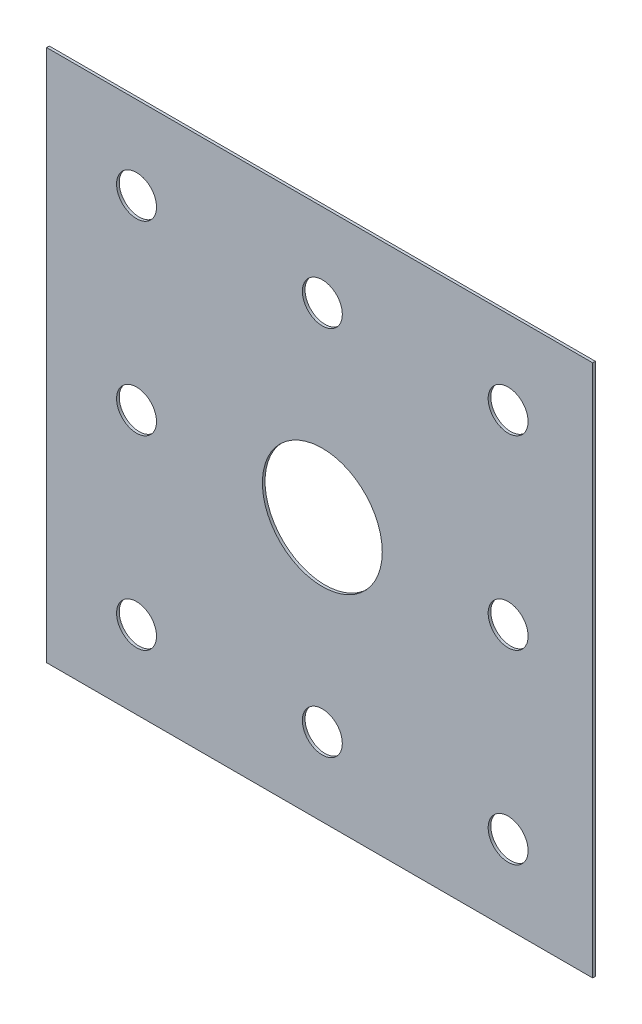
ISO-10303-21;
HEADER;
FILE_DESCRIPTION(('STEP AP214'),'2;1');
FILE_NAME('part.step','',(''),(''),'','','');
FILE_SCHEMA(('AUTOMOTIVE_DESIGN { 1 0 10303 214 1 1 1 1 }'));
ENDSEC;
DATA;
#1=APPLICATION_CONTEXT('core data for automotive mechanical design processes');
#2=APPLICATION_PROTOCOL_DEFINITION('international standard','automotive_design',2000,#1);
#3=PRODUCT_CONTEXT('',#1,'mechanical');
#4=PRODUCT('Part','Part','',(#3));
#5=PRODUCT_RELATED_PRODUCT_CATEGORY('part','',(#4));
#6=PRODUCT_DEFINITION_FORMATION('','',#4);
#7=PRODUCT_DEFINITION_CONTEXT('part definition',#1,'design');
#8=PRODUCT_DEFINITION('design','',#6,#7);
#9=PRODUCT_DEFINITION_SHAPE('','',#8);
#10=(LENGTH_UNIT() NAMED_UNIT(*) SI_UNIT(.MILLI.,.METRE.));
#11=(NAMED_UNIT(*) PLANE_ANGLE_UNIT() SI_UNIT($,.RADIAN.));
#12=(NAMED_UNIT(*) SI_UNIT($,.STERADIAN.) SOLID_ANGLE_UNIT());
#13=UNCERTAINTY_MEASURE_WITH_UNIT(LENGTH_MEASURE(1.E-05),#10,'distance_accuracy_value','');
#14=(GEOMETRIC_REPRESENTATION_CONTEXT(3) GLOBAL_UNCERTAINTY_ASSIGNED_CONTEXT((#13)) GLOBAL_UNIT_ASSIGNED_CONTEXT((#10,
#11,#12)) REPRESENTATION_CONTEXT('',''));
#15=CARTESIAN_POINT('',(0.,0.,0.));
#16=DIRECTION('',(0.,0.,1.));
#17=DIRECTION('',(1.,0.,0.));
#18=AXIS2_PLACEMENT_3D('',#15,#16,#17);
#19=CARTESIAN_POINT('',(0.,40.,0.2));
#20=DIRECTION('',(1.,0.,0.));
#21=DIRECTION('',(0.,0.,-1.));
#22=AXIS2_PLACEMENT_3D('',#19,#20,#21);
#23=PLANE('',#22);
#24=DIRECTION('',(0.,-1.,0.));
#25=VECTOR('',#24,1.);
#26=CARTESIAN_POINT('',(0.,40.,0.));
#27=LINE('',#26,#25);
#28=CARTESIAN_POINT('',(0.,40.,0.));
#29=VERTEX_POINT('',#28);
#30=CARTESIAN_POINT('',(0.,0.,0.));
#31=VERTEX_POINT('',#30);
#32=EDGE_CURVE('E98',#29,#31,#27,.T.);
#33=ORIENTED_EDGE('',*,*,#32,.T.);
#34=DIRECTION('',(0.,0.,-1.));
#35=VECTOR('',#34,1.);
#36=CARTESIAN_POINT('',(0.,0.,0.2));
#37=LINE('',#36,#35);
#38=CARTESIAN_POINT('',(0.,0.,0.2));
#39=VERTEX_POINT('',#38);
#40=EDGE_CURVE('E11',#39,#31,#37,.T.);
#41=ORIENTED_EDGE('',*,*,#40,.F.);
#42=DIRECTION('',(0.,-1.,0.));
#43=VECTOR('',#42,1.);
#44=CARTESIAN_POINT('',(0.,40.,0.2));
#45=LINE('',#44,#43);
#46=CARTESIAN_POINT('',(0.,40.,0.2));
#47=VERTEX_POINT('',#46);
#48=EDGE_CURVE('E86',#47,#39,#45,.T.);
#49=ORIENTED_EDGE('',*,*,#48,.F.);
#50=DIRECTION('',(0.,0.,-1.));
#51=VECTOR('',#50,1.);
#52=CARTESIAN_POINT('',(0.,40.,0.2));
#53=LINE('',#52,#51);
#54=EDGE_CURVE('E94',#47,#29,#53,.T.);
#55=ORIENTED_EDGE('',*,*,#54,.T.);
#56=EDGE_LOOP('',(#33,#41,#49,#55));
#57=FACE_BOUND('',#56,.T.);
#58=ADVANCED_FACE('F35',(#57),#23,.F.);
#59=CARTESIAN_POINT('',(0.,0.,0.2));
#60=DIRECTION('',(0.,1.,0.));
#61=DIRECTION('',(0.,0.,1.));
#62=AXIS2_PLACEMENT_3D('',#59,#60,#61);
#63=PLANE('',#62);
#64=DIRECTION('',(1.,0.,0.));
#65=VECTOR('',#64,1.);
#66=CARTESIAN_POINT('',(0.,0.,0.));
#67=LINE('',#66,#65);
#68=CARTESIAN_POINT('',(41.,0.,0.));
#69=VERTEX_POINT('',#68);
#70=EDGE_CURVE('E90',#31,#69,#67,.T.);
#71=ORIENTED_EDGE('',*,*,#70,.T.);
#72=DIRECTION('',(0.,0.,-1.));
#73=VECTOR('',#72,1.);
#74=CARTESIAN_POINT('',(41.,0.,0.2));
#75=LINE('',#74,#73);
#76=CARTESIAN_POINT('',(41.,0.,0.2));
#77=VERTEX_POINT('',#76);
#78=EDGE_CURVE('E43',#77,#69,#75,.T.);
#79=ORIENTED_EDGE('',*,*,#78,.F.);
#80=DIRECTION('',(1.,0.,0.));
#81=VECTOR('',#80,1.);
#82=CARTESIAN_POINT('',(0.,0.,0.2));
#83=LINE('',#82,#81);
#84=EDGE_CURVE('E81',#39,#77,#83,.T.);
#85=ORIENTED_EDGE('',*,*,#84,.F.);
#86=ORIENTED_EDGE('',*,*,#40,.T.);
#87=EDGE_LOOP('',(#71,#79,#85,#86));
#88=FACE_BOUND('',#87,.T.);
#89=ADVANCED_FACE('F89',(#88),#63,.F.);
#90=CARTESIAN_POINT('',(41.,40.,0.2));
#91=DIRECTION('',(-1.,0.,0.));
#92=DIRECTION('',(0.,0.,1.));
#93=AXIS2_PLACEMENT_3D('',#90,#91,#92);
#94=PLANE('',#93);
#95=DIRECTION('',(0.,1.,0.));
#96=VECTOR('',#95,1.);
#97=CARTESIAN_POINT('',(41.,40.,0.));
#98=LINE('',#97,#96);
#99=CARTESIAN_POINT('',(41.,40.,0.));
#100=VERTEX_POINT('',#99);
#101=EDGE_CURVE('E68',#69,#100,#98,.T.);
#102=ORIENTED_EDGE('',*,*,#101,.T.);
#103=DIRECTION('',(0.,0.,-1.));
#104=VECTOR('',#103,1.);
#105=CARTESIAN_POINT('',(41.,40.,0.2));
#106=LINE('',#105,#104);
#107=CARTESIAN_POINT('',(41.,40.,0.2));
#108=VERTEX_POINT('',#107);
#109=EDGE_CURVE('E91',#108,#100,#106,.T.);
#110=ORIENTED_EDGE('',*,*,#109,.F.);
#111=DIRECTION('',(0.,1.,0.));
#112=VECTOR('',#111,1.);
#113=CARTESIAN_POINT('',(41.,40.,0.2));
#114=LINE('',#113,#112);
#115=EDGE_CURVE('E84',#77,#108,#114,.T.);
#116=ORIENTED_EDGE('',*,*,#115,.F.);
#117=ORIENTED_EDGE('',*,*,#78,.T.);
#118=EDGE_LOOP('',(#102,#110,#116,#117));
#119=FACE_BOUND('',#118,.T.);
#120=ADVANCED_FACE('F92',(#119),#94,.F.);
#121=CARTESIAN_POINT('',(0.,40.,0.2));
#122=DIRECTION('',(0.,-1.,0.));
#123=DIRECTION('',(0.,0.,-1.));
#124=AXIS2_PLACEMENT_3D('',#121,#122,#123);
#125=PLANE('',#124);
#126=DIRECTION('',(-1.,0.,0.));
#127=VECTOR('',#126,1.);
#128=CARTESIAN_POINT('',(0.,40.,0.));
#129=LINE('',#128,#127);
#130=EDGE_CURVE('E74',#100,#29,#129,.T.);
#131=ORIENTED_EDGE('',*,*,#130,.T.);
#132=ORIENTED_EDGE('',*,*,#54,.F.);
#133=DIRECTION('',(-1.,0.,0.));
#134=VECTOR('',#133,1.);
#135=CARTESIAN_POINT('',(0.,40.,0.2));
#136=LINE('',#135,#134);
#137=EDGE_CURVE('E51',#108,#47,#136,.T.);
#138=ORIENTED_EDGE('',*,*,#137,.F.);
#139=ORIENTED_EDGE('',*,*,#109,.T.);
#140=EDGE_LOOP('',(#131,#132,#138,#139));
#141=FACE_BOUND('',#140,.T.);
#142=ADVANCED_FACE('F106',(#141),#125,.F.);
#143=CARTESIAN_POINT('',(0.,0.,0.2));
#144=DIRECTION('',(0.,0.,1.));
#145=DIRECTION('',(1.,0.,0.));
#146=AXIS2_PLACEMENT_3D('',#143,#144,#145);
#147=PLANE('',#146);
#148=CARTESIAN_POINT('',(6.74999999999955,5.8499999999996,0.2));
#149=DIRECTION('',(0.,0.,1.));
#150=DIRECTION('',(1.,0.,0.));
#151=AXIS2_PLACEMENT_3D('',#148,#149,#150);
#152=CIRCLE('',#151,1.49999999999996);
#153=CARTESIAN_POINT('',(8.2499999999995,5.8499999999996,0.2));
#154=VERTEX_POINT('',#153);
#155=EDGE_CURVE('E134',#154,#154,#152,.T.);
#156=ORIENTED_EDGE('',*,*,#155,.F.);
#157=EDGE_LOOP('',(#156));
#158=FACE_BOUND('',#157,.T.);
#159=CARTESIAN_POINT('',(6.74999999999954,33.7499999999998,0.2));
#160=DIRECTION('',(0.,0.,1.));
#161=DIRECTION('',(1.,0.,0.));
#162=AXIS2_PLACEMENT_3D('',#159,#160,#161);
#163=CIRCLE('',#162,1.50000000000028);
#164=CARTESIAN_POINT('',(8.24999999999982,33.7499999999998,0.2));
#165=VERTEX_POINT('',#164);
#166=EDGE_CURVE('E127',#165,#165,#163,.T.);
#167=ORIENTED_EDGE('',*,*,#166,.F.);
#168=EDGE_LOOP('',(#167));
#169=FACE_BOUND('',#168,.T.);
#170=CARTESIAN_POINT('',(6.75,19.8000000000001,0.2));
#171=DIRECTION('',(0.,0.,1.));
#172=DIRECTION('',(1.,0.,0.));
#173=AXIS2_PLACEMENT_3D('',#170,#171,#172);
#174=CIRCLE('',#173,1.5);
#175=CARTESIAN_POINT('',(8.25,19.8000000000001,0.2));
#176=VERTEX_POINT('',#175);
#177=EDGE_CURVE('E128',#176,#176,#174,.T.);
#178=ORIENTED_EDGE('',*,*,#177,.F.);
#179=EDGE_LOOP('',(#178));
#180=FACE_BOUND('',#179,.T.);
#181=CARTESIAN_POINT('',(34.6499999999997,5.8499999999996,0.2));
#182=DIRECTION('',(0.,0.,1.));
#183=DIRECTION('',(1.,0.,0.));
#184=AXIS2_PLACEMENT_3D('',#181,#182,#183);
#185=CIRCLE('',#184,1.49999999999923);
#186=CARTESIAN_POINT('',(36.1499999999989,5.8499999999996,0.2));
#187=VERTEX_POINT('',#186);
#188=EDGE_CURVE('E145',#187,#187,#185,.T.);
#189=ORIENTED_EDGE('',*,*,#188,.F.);
#190=EDGE_LOOP('',(#189));
#191=FACE_BOUND('',#190,.T.);
#192=CARTESIAN_POINT('',(20.6999999999999,5.85000000000001,0.2));
#193=DIRECTION('',(0.,0.,1.));
#194=DIRECTION('',(1.,0.,0.));
#195=AXIS2_PLACEMENT_3D('',#192,#193,#194);
#196=CIRCLE('',#195,1.5);
#197=CARTESIAN_POINT('',(22.2,5.85000000000001,0.2));
#198=VERTEX_POINT('',#197);
#199=EDGE_CURVE('E151',#198,#198,#196,.T.);
#200=ORIENTED_EDGE('',*,*,#199,.F.);
#201=EDGE_LOOP('',(#200));
#202=FACE_BOUND('',#201,.T.);
#203=CARTESIAN_POINT('',(34.65,19.8,0.2));
#204=DIRECTION('',(0.,0.,1.));
#205=DIRECTION('',(1.,0.,0.));
#206=AXIS2_PLACEMENT_3D('',#203,#204,#205);
#207=CIRCLE('',#206,1.5);
#208=CARTESIAN_POINT('',(36.15,19.8,0.2));
#209=VERTEX_POINT('',#208);
#210=EDGE_CURVE('E157',#209,#209,#207,.T.);
#211=ORIENTED_EDGE('',*,*,#210,.F.);
#212=EDGE_LOOP('',(#211));
#213=FACE_BOUND('',#212,.T.);
#214=CARTESIAN_POINT('',(34.6499999999997,33.7499999999998,0.2));
#215=DIRECTION('',(0.,0.,1.));
#216=DIRECTION('',(1.,0.,0.));
#217=AXIS2_PLACEMENT_3D('',#214,#215,#216);
#218=CIRCLE('',#217,1.49999999999967);
#219=CARTESIAN_POINT('',(36.1499999999994,33.7499999999998,0.2));
#220=VERTEX_POINT('',#219);
#221=EDGE_CURVE('E121',#220,#220,#218,.T.);
#222=ORIENTED_EDGE('',*,*,#221,.F.);
#223=EDGE_LOOP('',(#222));
#224=FACE_BOUND('',#223,.T.);
#225=CARTESIAN_POINT('',(20.7000000000002,33.75,0.2));
#226=DIRECTION('',(0.,0.,1.));
#227=DIRECTION('',(1.,0.,0.));
#228=AXIS2_PLACEMENT_3D('',#225,#226,#227);
#229=CIRCLE('',#228,1.50000000000001);
#230=CARTESIAN_POINT('',(22.2000000000002,33.75,0.2));
#231=VERTEX_POINT('',#230);
#232=EDGE_CURVE('E118',#231,#231,#229,.T.);
#233=ORIENTED_EDGE('',*,*,#232,.F.);
#234=EDGE_LOOP('',(#233));
#235=FACE_BOUND('',#234,.T.);
#236=CARTESIAN_POINT('',(20.7,19.8,0.2));
#237=DIRECTION('',(0.,0.,1.));
#238=DIRECTION('',(1.,0.,0.));
#239=AXIS2_PLACEMENT_3D('',#236,#237,#238);
#240=CIRCLE('',#239,4.5);
#241=CARTESIAN_POINT('',(25.2,19.8,0.2));
#242=VERTEX_POINT('',#241);
#243=EDGE_CURVE('E112',#242,#242,#240,.T.);
#244=ORIENTED_EDGE('',*,*,#243,.F.);
#245=EDGE_LOOP('',(#244));
#246=FACE_BOUND('',#245,.T.);
#247=ORIENTED_EDGE('',*,*,#48,.T.);
#248=ORIENTED_EDGE('',*,*,#84,.T.);
#249=ORIENTED_EDGE('',*,*,#115,.T.);
#250=ORIENTED_EDGE('',*,*,#137,.T.);
#251=EDGE_LOOP('',(#247,#248,#249,#250));
#252=FACE_BOUND('',#251,.T.);
#253=ADVANCED_FACE('F82',(#158,#169,#180,#191,#202,#213,#224,#235,#246,#252),#147,.T.);
#254=CARTESIAN_POINT('',(0.,0.,0.));
#255=DIRECTION('',(0.,0.,1.));
#256=DIRECTION('',(1.,0.,0.));
#257=AXIS2_PLACEMENT_3D('',#254,#255,#256);
#258=PLANE('',#257);
#259=CARTESIAN_POINT('',(6.74999999999955,5.8499999999996,0.));
#260=DIRECTION('',(0.,0.,1.));
#261=DIRECTION('',(1.,0.,0.));
#262=AXIS2_PLACEMENT_3D('',#259,#260,#261);
#263=CIRCLE('',#262,1.49999999999996);
#264=CARTESIAN_POINT('',(8.2499999999995,5.8499999999996,0.));
#265=VERTEX_POINT('',#264);
#266=EDGE_CURVE('E131',#265,#265,#263,.T.);
#267=ORIENTED_EDGE('',*,*,#266,.T.);
#268=EDGE_LOOP('',(#267));
#269=FACE_BOUND('',#268,.T.);
#270=CARTESIAN_POINT('',(6.74999999999954,33.7499999999998,0.));
#271=DIRECTION('',(0.,0.,1.));
#272=DIRECTION('',(1.,0.,0.));
#273=AXIS2_PLACEMENT_3D('',#270,#271,#272);
#274=CIRCLE('',#273,1.50000000000028);
#275=CARTESIAN_POINT('',(8.24999999999982,33.7499999999998,0.));
#276=VERTEX_POINT('',#275);
#277=EDGE_CURVE('E124',#276,#276,#274,.T.);
#278=ORIENTED_EDGE('',*,*,#277,.T.);
#279=EDGE_LOOP('',(#278));
#280=FACE_BOUND('',#279,.T.);
#281=CARTESIAN_POINT('',(6.75,19.8000000000001,0.));
#282=DIRECTION('',(0.,0.,1.));
#283=DIRECTION('',(1.,0.,0.));
#284=AXIS2_PLACEMENT_3D('',#281,#282,#283);
#285=CIRCLE('',#284,1.5);
#286=CARTESIAN_POINT('',(8.25,19.8000000000001,0.));
#287=VERTEX_POINT('',#286);
#288=EDGE_CURVE('E138',#287,#287,#285,.T.);
#289=ORIENTED_EDGE('',*,*,#288,.T.);
#290=EDGE_LOOP('',(#289));
#291=FACE_BOUND('',#290,.T.);
#292=CARTESIAN_POINT('',(34.6499999999997,5.8499999999996,0.));
#293=DIRECTION('',(0.,0.,1.));
#294=DIRECTION('',(1.,0.,0.));
#295=AXIS2_PLACEMENT_3D('',#292,#293,#294);
#296=CIRCLE('',#295,1.49999999999923);
#297=CARTESIAN_POINT('',(36.1499999999989,5.8499999999996,0.));
#298=VERTEX_POINT('',#297);
#299=EDGE_CURVE('E137',#298,#298,#296,.T.);
#300=ORIENTED_EDGE('',*,*,#299,.T.);
#301=EDGE_LOOP('',(#300));
#302=FACE_BOUND('',#301,.T.);
#303=CARTESIAN_POINT('',(20.6999999999999,5.85000000000001,0.));
#304=DIRECTION('',(0.,0.,1.));
#305=DIRECTION('',(1.,0.,0.));
#306=AXIS2_PLACEMENT_3D('',#303,#304,#305);
#307=CIRCLE('',#306,1.5);
#308=CARTESIAN_POINT('',(22.2,5.85000000000001,0.));
#309=VERTEX_POINT('',#308);
#310=EDGE_CURVE('E148',#309,#309,#307,.T.);
#311=ORIENTED_EDGE('',*,*,#310,.T.);
#312=EDGE_LOOP('',(#311));
#313=FACE_BOUND('',#312,.T.);
#314=CARTESIAN_POINT('',(34.65,19.8,0.));
#315=DIRECTION('',(0.,0.,1.));
#316=DIRECTION('',(1.,0.,0.));
#317=AXIS2_PLACEMENT_3D('',#314,#315,#316);
#318=CIRCLE('',#317,1.5);
#319=CARTESIAN_POINT('',(36.15,19.8,0.));
#320=VERTEX_POINT('',#319);
#321=EDGE_CURVE('E154',#320,#320,#318,.T.);
#322=ORIENTED_EDGE('',*,*,#321,.T.);
#323=EDGE_LOOP('',(#322));
#324=FACE_BOUND('',#323,.T.);
#325=CARTESIAN_POINT('',(34.6499999999997,33.7499999999998,0.));
#326=DIRECTION('',(0.,0.,1.));
#327=DIRECTION('',(1.,0.,0.));
#328=AXIS2_PLACEMENT_3D('',#325,#326,#327);
#329=CIRCLE('',#328,1.49999999999967);
#330=CARTESIAN_POINT('',(36.1499999999994,33.7499999999998,0.));
#331=VERTEX_POINT('',#330);
#332=EDGE_CURVE('E160',#331,#331,#329,.T.);
#333=ORIENTED_EDGE('',*,*,#332,.T.);
#334=EDGE_LOOP('',(#333));
#335=FACE_BOUND('',#334,.T.);
#336=CARTESIAN_POINT('',(20.7000000000002,33.75,0.));
#337=DIRECTION('',(0.,0.,1.));
#338=DIRECTION('',(1.,0.,0.));
#339=AXIS2_PLACEMENT_3D('',#336,#337,#338);
#340=CIRCLE('',#339,1.50000000000001);
#341=CARTESIAN_POINT('',(22.2000000000002,33.75,0.));
#342=VERTEX_POINT('',#341);
#343=EDGE_CURVE('E115',#342,#342,#340,.T.);
#344=ORIENTED_EDGE('',*,*,#343,.T.);
#345=EDGE_LOOP('',(#344));
#346=FACE_BOUND('',#345,.T.);
#347=CARTESIAN_POINT('',(20.7,19.8,0.));
#348=DIRECTION('',(0.,0.,1.));
#349=DIRECTION('',(1.,0.,0.));
#350=AXIS2_PLACEMENT_3D('',#347,#348,#349);
#351=CIRCLE('',#350,4.5);
#352=CARTESIAN_POINT('',(25.2,19.8,0.));
#353=VERTEX_POINT('',#352);
#354=EDGE_CURVE('E101',#353,#353,#351,.T.);
#355=ORIENTED_EDGE('',*,*,#354,.T.);
#356=EDGE_LOOP('',(#355));
#357=FACE_BOUND('',#356,.T.);
#358=ORIENTED_EDGE('',*,*,#32,.F.);
#359=ORIENTED_EDGE('',*,*,#130,.F.);
#360=ORIENTED_EDGE('',*,*,#101,.F.);
#361=ORIENTED_EDGE('',*,*,#70,.F.);
#362=EDGE_LOOP('',(#358,#359,#360,#361));
#363=FACE_BOUND('',#362,.T.);
#364=ADVANCED_FACE('F109',(#269,#280,#291,#302,#313,#324,#335,#346,#357,#363),#258,.F.);
#365=CARTESIAN_POINT('',(20.7,19.8,0.));
#366=DIRECTION('',(0.,0.,1.));
#367=DIRECTION('',(1.,0.,0.));
#368=AXIS2_PLACEMENT_3D('',#365,#366,#367);
#369=CYLINDRICAL_SURFACE('',#368,4.5);
#370=ORIENTED_EDGE('',*,*,#354,.F.);
#371=EDGE_LOOP('',(#370));
#372=FACE_BOUND('',#371,.T.);
#373=ORIENTED_EDGE('',*,*,#243,.T.);
#374=EDGE_LOOP('',(#373));
#375=FACE_BOUND('',#374,.T.);
#376=ADVANCED_FACE('F176',(#372,#375),#369,.F.);
#377=CARTESIAN_POINT('',(20.7000000000002,33.75,0.));
#378=DIRECTION('',(0.,0.,1.));
#379=DIRECTION('',(1.,0.,0.));
#380=AXIS2_PLACEMENT_3D('',#377,#378,#379);
#381=CYLINDRICAL_SURFACE('',#380,1.50000000000001);
#382=ORIENTED_EDGE('',*,*,#343,.F.);
#383=EDGE_LOOP('',(#382));
#384=FACE_BOUND('',#383,.T.);
#385=ORIENTED_EDGE('',*,*,#232,.T.);
#386=EDGE_LOOP('',(#385));
#387=FACE_BOUND('',#386,.T.);
#388=ADVANCED_FACE('F178',(#384,#387),#381,.F.);
#389=CARTESIAN_POINT('',(34.6499999999997,33.7499999999998,0.));
#390=DIRECTION('',(0.,0.,1.));
#391=DIRECTION('',(1.,0.,0.));
#392=AXIS2_PLACEMENT_3D('',#389,#390,#391);
#393=CYLINDRICAL_SURFACE('',#392,1.49999999999967);
#394=ORIENTED_EDGE('',*,*,#332,.F.);
#395=EDGE_LOOP('',(#394));
#396=FACE_BOUND('',#395,.T.);
#397=ORIENTED_EDGE('',*,*,#221,.T.);
#398=EDGE_LOOP('',(#397));
#399=FACE_BOUND('',#398,.T.);
#400=ADVANCED_FACE('F166',(#396,#399),#393,.F.);
#401=CARTESIAN_POINT('',(34.65,19.8,0.));
#402=DIRECTION('',(0.,0.,1.));
#403=DIRECTION('',(1.,0.,0.));
#404=AXIS2_PLACEMENT_3D('',#401,#402,#403);
#405=CYLINDRICAL_SURFACE('',#404,1.5);
#406=ORIENTED_EDGE('',*,*,#321,.F.);
#407=EDGE_LOOP('',(#406));
#408=FACE_BOUND('',#407,.T.);
#409=ORIENTED_EDGE('',*,*,#210,.T.);
#410=EDGE_LOOP('',(#409));
#411=FACE_BOUND('',#410,.T.);
#412=ADVANCED_FACE('F228',(#408,#411),#405,.F.);
#413=CARTESIAN_POINT('',(20.6999999999999,5.85000000000001,0.));
#414=DIRECTION('',(0.,0.,1.));
#415=DIRECTION('',(1.,0.,0.));
#416=AXIS2_PLACEMENT_3D('',#413,#414,#415);
#417=CYLINDRICAL_SURFACE('',#416,1.5);
#418=ORIENTED_EDGE('',*,*,#310,.F.);
#419=EDGE_LOOP('',(#418));
#420=FACE_BOUND('',#419,.T.);
#421=ORIENTED_EDGE('',*,*,#199,.T.);
#422=EDGE_LOOP('',(#421));
#423=FACE_BOUND('',#422,.T.);
#424=ADVANCED_FACE('F238',(#420,#423),#417,.F.);
#425=CARTESIAN_POINT('',(34.6499999999997,5.8499999999996,0.));
#426=DIRECTION('',(0.,0.,1.));
#427=DIRECTION('',(1.,0.,0.));
#428=AXIS2_PLACEMENT_3D('',#425,#426,#427);
#429=CYLINDRICAL_SURFACE('',#428,1.49999999999923);
#430=ORIENTED_EDGE('',*,*,#299,.F.);
#431=EDGE_LOOP('',(#430));
#432=FACE_BOUND('',#431,.T.);
#433=ORIENTED_EDGE('',*,*,#188,.T.);
#434=EDGE_LOOP('',(#433));
#435=FACE_BOUND('',#434,.T.);
#436=ADVANCED_FACE('F248',(#432,#435),#429,.F.);
#437=CARTESIAN_POINT('',(6.75,19.8000000000001,0.));
#438=DIRECTION('',(0.,0.,1.));
#439=DIRECTION('',(1.,0.,0.));
#440=AXIS2_PLACEMENT_3D('',#437,#438,#439);
#441=CYLINDRICAL_SURFACE('',#440,1.5);
#442=ORIENTED_EDGE('',*,*,#288,.F.);
#443=EDGE_LOOP('',(#442));
#444=FACE_BOUND('',#443,.T.);
#445=ORIENTED_EDGE('',*,*,#177,.T.);
#446=EDGE_LOOP('',(#445));
#447=FACE_BOUND('',#446,.T.);
#448=ADVANCED_FACE('F258',(#444,#447),#441,.F.);
#449=CARTESIAN_POINT('',(6.74999999999954,33.7499999999998,0.));
#450=DIRECTION('',(0.,0.,1.));
#451=DIRECTION('',(1.,0.,0.));
#452=AXIS2_PLACEMENT_3D('',#449,#450,#451);
#453=CYLINDRICAL_SURFACE('',#452,1.50000000000028);
#454=ORIENTED_EDGE('',*,*,#277,.F.);
#455=EDGE_LOOP('',(#454));
#456=FACE_BOUND('',#455,.T.);
#457=ORIENTED_EDGE('',*,*,#166,.T.);
#458=EDGE_LOOP('',(#457));
#459=FACE_BOUND('',#458,.T.);
#460=ADVANCED_FACE('F268',(#456,#459),#453,.F.);
#461=CARTESIAN_POINT('',(6.74999999999955,5.8499999999996,0.));
#462=DIRECTION('',(0.,0.,1.));
#463=DIRECTION('',(1.,0.,0.));
#464=AXIS2_PLACEMENT_3D('',#461,#462,#463);
#465=CYLINDRICAL_SURFACE('',#464,1.49999999999996);
#466=ORIENTED_EDGE('',*,*,#266,.F.);
#467=EDGE_LOOP('',(#466));
#468=FACE_BOUND('',#467,.T.);
#469=ORIENTED_EDGE('',*,*,#155,.T.);
#470=EDGE_LOOP('',(#469));
#471=FACE_BOUND('',#470,.T.);
#472=ADVANCED_FACE('F278',(#468,#471),#465,.F.);
#473=CLOSED_SHELL('',(#58,#89,#120,#142,#253,#364,#376,#388,#400,#412,#424,#436,#448,#460,#472));
#474=MANIFOLD_SOLID_BREP('B2',#473);
#475=ADVANCED_BREP_SHAPE_REPRESENTATION('',(#18,#474),#14);
#476=SHAPE_DEFINITION_REPRESENTATION(#9,#475);
ENDSEC;
END-ISO-10303-21;
